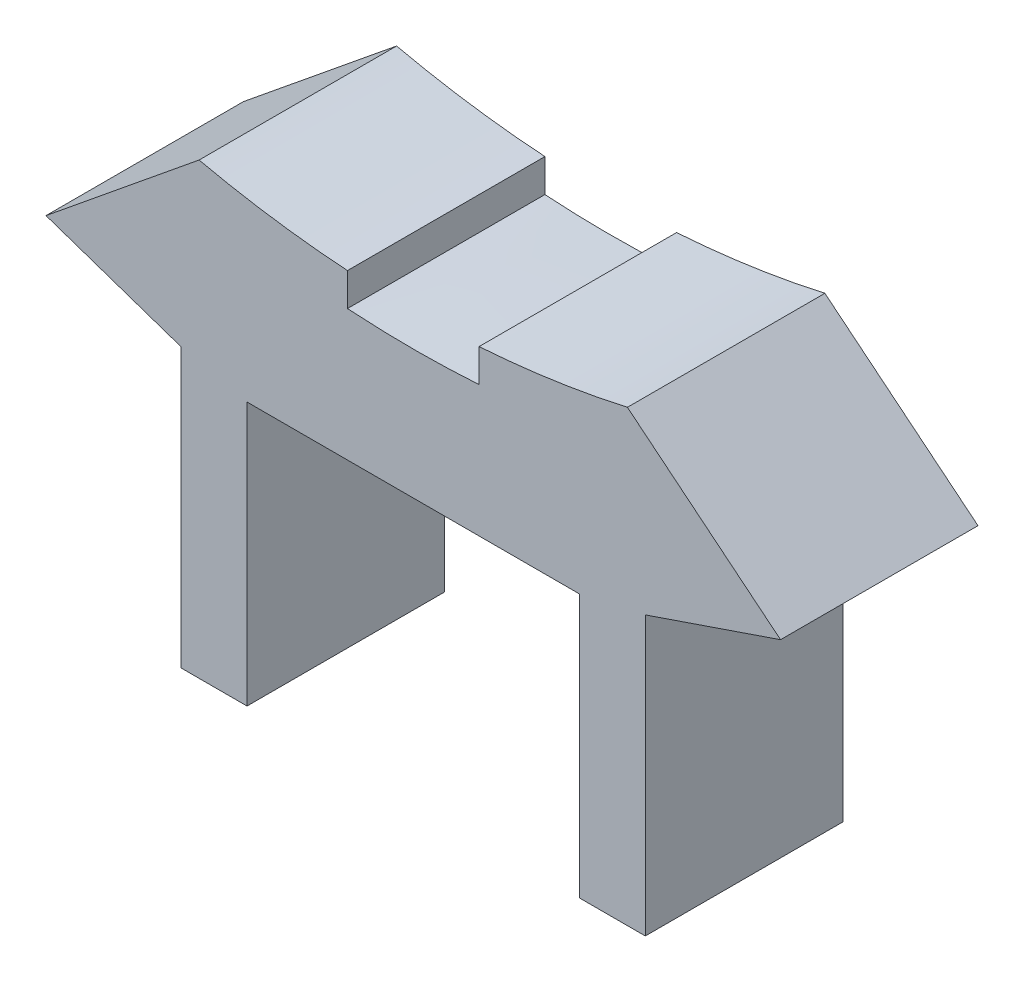
ISO-10303-21;
HEADER;
FILE_DESCRIPTION(('STEP AP214'),'2;1');
FILE_NAME('part.step','',(''),(''),'','','');
FILE_SCHEMA(('AUTOMOTIVE_DESIGN { 1 0 10303 214 1 1 1 1 }'));
ENDSEC;
DATA;
#1=APPLICATION_CONTEXT('core data for automotive mechanical design processes');
#2=APPLICATION_PROTOCOL_DEFINITION('international standard','automotive_design',2000,#1);
#3=PRODUCT_CONTEXT('',#1,'mechanical');
#4=PRODUCT('Part','Part','',(#3));
#5=PRODUCT_RELATED_PRODUCT_CATEGORY('part','',(#4));
#6=PRODUCT_DEFINITION_FORMATION('','',#4);
#7=PRODUCT_DEFINITION_CONTEXT('part definition',#1,'design');
#8=PRODUCT_DEFINITION('design','',#6,#7);
#9=PRODUCT_DEFINITION_SHAPE('','',#8);
#10=(LENGTH_UNIT() NAMED_UNIT(*) SI_UNIT(.MILLI.,.METRE.));
#11=(NAMED_UNIT(*) PLANE_ANGLE_UNIT() SI_UNIT($,.RADIAN.));
#12=(NAMED_UNIT(*) SI_UNIT($,.STERADIAN.) SOLID_ANGLE_UNIT());
#13=UNCERTAINTY_MEASURE_WITH_UNIT(LENGTH_MEASURE(1.E-05),#10,'distance_accuracy_value','');
#14=(GEOMETRIC_REPRESENTATION_CONTEXT(3) GLOBAL_UNCERTAINTY_ASSIGNED_CONTEXT((#13)) GLOBAL_UNIT_ASSIGNED_CONTEXT((#10,
#11,#12)) REPRESENTATION_CONTEXT('',''));
#15=CARTESIAN_POINT('',(0.,0.,0.));
#16=DIRECTION('',(0.,0.,1.));
#17=DIRECTION('',(1.,0.,0.));
#18=AXIS2_PLACEMENT_3D('',#15,#16,#17);
#19=CARTESIAN_POINT('',(0.,2.46330733588707E-13,6.));
#20=DIRECTION('',(0.,0.,-1.));
#21=DIRECTION('',(-1.,0.,0.));
#22=AXIS2_PLACEMENT_3D('',#19,#20,#21);
#23=CYLINDRICAL_SURFACE('',#22,29.6427241251883);
#24=CARTESIAN_POINT('',(2.,-29.5751769827673,0.794104965163162));
#25=DIRECTION('',(0.,0.,-1.));
#26=VECTOR('',#25,1.);
#27=LINE('',#24,#26);
#28=CARTESIAN_POINT('',(2.,-29.5751753634774,0.794104965163163));
#29=VERTEX_POINT('',#28);
#30=CARTESIAN_POINT('',(1.99998290484577,-29.5753999279057,5.82734234378056E-11));
#31=VERTEX_POINT('',#30);
#32=EDGE_CURVE('E252',#29,#31,#27,.T.);
#33=ORIENTED_EDGE('',*,*,#32,.F.);
#34=CARTESIAN_POINT('',(2.,-29.5751769827673,1.46425258115946));
#35=DIRECTION('',(0.,0.,-1.));
#36=VECTOR('',#35,1.);
#37=LINE('',#34,#36);
#38=CARTESIAN_POINT('',(2.,-29.5751769827673,1.46425258115946));
#39=VERTEX_POINT('',#38);
#40=EDGE_CURVE('E247',#39,#29,#37,.T.);
#41=ORIENTED_EDGE('',*,*,#40,.F.);
#42=DIRECTION('',(0.,0.,1.));
#43=VECTOR('',#42,1.);
#44=CARTESIAN_POINT('',(2.,-29.5751769827673,6.));
#45=LINE('',#44,#43);
#46=CARTESIAN_POINT('',(2.,-29.5751769827673,4.53627099661344));
#47=VERTEX_POINT('',#46);
#48=EDGE_CURVE('E236',#47,#39,#45,.F.);
#49=ORIENTED_EDGE('',*,*,#48,.F.);
#50=CARTESIAN_POINT('',(2.,-29.5751769827673,5.20603168382745));
#51=DIRECTION('',(0.,0.,-1.));
#52=VECTOR('',#51,1.);
#53=LINE('',#50,#52);
#54=CARTESIAN_POINT('',(2.,-29.5751754602162,5.20603168382745));
#55=VERTEX_POINT('',#54);
#56=EDGE_CURVE('E231',#55,#47,#53,.T.);
#57=ORIENTED_EDGE('',*,*,#56,.F.);
#58=DIRECTION('',(0.,0.,1.));
#59=VECTOR('',#58,1.);
#60=CARTESIAN_POINT('',(2.,-29.5751769827673,6.));
#61=LINE('',#60,#59);
#62=CARTESIAN_POINT('',(2.,-29.5751769827673,6.));
#63=VERTEX_POINT('',#62);
#64=EDGE_CURVE('E239',#63,#55,#61,.F.);
#65=ORIENTED_EDGE('',*,*,#64,.F.);
#66=CARTESIAN_POINT('',(0.,2.46330733588707E-13,6.));
#67=DIRECTION('',(0.,0.,-1.));
#68=DIRECTION('',(1.,0.,0.));
#69=AXIS2_PLACEMENT_3D('',#66,#67,#68);
#70=CIRCLE('',#69,29.6427241251883);
#71=CARTESIAN_POINT('',(6.50697593404914,-28.9197226431325,6.));
#72=VERTEX_POINT('',#71);
#73=EDGE_CURVE('E345',#72,#63,#70,.T.);
#74=ORIENTED_EDGE('',*,*,#73,.F.);
#75=DIRECTION('',(0.,0.,-1.));
#76=VECTOR('',#75,1.);
#77=CARTESIAN_POINT('',(6.50697593404914,-28.9197226431325,6.));
#78=LINE('',#77,#76);
#79=CARTESIAN_POINT('',(6.50697593404914,-28.9197226431325,0.));
#80=VERTEX_POINT('',#79);
#81=EDGE_CURVE('E302',#72,#80,#78,.T.);
#82=ORIENTED_EDGE('',*,*,#81,.T.);
#83=CARTESIAN_POINT('',(0.,2.46330733588707E-13,0.));
#84=DIRECTION('',(0.,0.,-1.));
#85=DIRECTION('',(1.,0.,0.));
#86=AXIS2_PLACEMENT_3D('',#83,#84,#85);
#87=CIRCLE('',#86,29.6427241251883);
#88=EDGE_CURVE('E306',#80,#31,#87,.T.);
#89=ORIENTED_EDGE('',*,*,#88,.T.);
#90=EDGE_LOOP('',(#33,#41,#49,#57,#65,#74,#82,#89));
#91=FACE_BOUND('',#90,.T.);
#92=ADVANCED_FACE('F89',(#91),#23,.F.);
#93=CARTESIAN_POINT('',(0.,2.46330733588707E-13,6.));
#94=DIRECTION('',(0.,0.,1.));
#95=DIRECTION('',(1.,0.,0.));
#96=AXIS2_PLACEMENT_3D('',#93,#94,#95);
#97=PLANE('',#96);
#98=ORIENTED_EDGE('',*,*,#73,.T.);
#99=DIRECTION('',(0.,-1.,0.));
#100=VECTOR('',#99,1.);
#101=CARTESIAN_POINT('',(2.,-29.5751769827673,6.));
#102=LINE('',#101,#100);
#103=CARTESIAN_POINT('',(1.99999999993751,-30.5758905770925,6.));
#104=VERTEX_POINT('',#103);
#105=EDGE_CURVE('E403',#63,#104,#102,.T.);
#106=ORIENTED_EDGE('',*,*,#105,.T.);
#107=CARTESIAN_POINT('',(-2.,-30.5761285399981,6.));
#108=CARTESIAN_POINT('',(-1.91668888544796,-30.5813932001455,6.));
#109=CARTESIAN_POINT('',(-1.83336000291558,-30.5863808461374,6.));
#110=CARTESIAN_POINT('',(-1.66670065223996,-30.595766432718,6.));
#111=CARTESIAN_POINT('',(-1.58337019658692,-30.6001645953618,6.));
#112=CARTESIAN_POINT('',(-1.41670746324046,-30.6083381563696,6.));
#113=CARTESIAN_POINT('',(-1.33337519609819,-30.6121137691073,6.));
#114=CARTESIAN_POINT('',(-1.16670900211733,-30.6190153944898,6.));
#115=CARTESIAN_POINT('',(-1.08337508343158,-30.6221416036082,6.));
#116=CARTESIAN_POINT('',(-0.916705780400924,-30.6277221687569,6.));
#117=CARTESIAN_POINT('',(-0.833370401748876,-30.6301766943803,6.));
#118=CARTESIAN_POINT('',(-0.666698475997224,-30.6343966682864,6.));
#119=CARTESIAN_POINT('',(-0.583361932317296,-30.6361622513151,6.));
#120=CARTESIAN_POINT('',(-0.41668803091709,-30.6389920299726,6.));
#121=CARTESIAN_POINT('',(-0.333350674788869,-30.6400563191487,6.));
#122=CARTESIAN_POINT('',(-0.166675545586474,-30.6414761478316,6.));
#123=CARTESIAN_POINT('',(-0.0833377729214095,-30.6418317352508,6.));
#124=CARTESIAN_POINT('',(0.0833377724103954,-30.6418317375408,6.));
#125=CARTESIAN_POINT('',(0.166675545077136,-30.6414761524118,6.));
#126=CARTESIAN_POINT('',(0.333350674286005,-30.6400563275434,6.));
#127=CARTESIAN_POINT('',(0.416688030419025,-30.6389920398918,6.));
#128=CARTESIAN_POINT('',(0.583361931831253,-30.636162262806,6.));
#129=CARTESIAN_POINT('',(0.6666984755184,-30.6343966798242,6.));
#130=CARTESIAN_POINT('',(0.833370401285858,-30.6301767039316,6.));
#131=CARTESIAN_POINT('',(0.916705779946469,-30.6277221762737,6.));
#132=CARTESIAN_POINT('',(1.08337508299401,-30.6221416045318,6.));
#133=CARTESIAN_POINT('',(1.16670900168803,-30.6190153908531,6.));
#134=CARTESIAN_POINT('',(1.33337519568399,-30.6121137536041,6.));
#135=CARTESIAN_POINT('',(1.416707462833,-30.6083381335582,6.));
#136=CARTESIAN_POINT('',(1.58337019618748,-30.6001645552079,6.));
#137=CARTESIAN_POINT('',(1.66670065184165,-30.5957663825276,6.));
#138=CARTESIAN_POINT('',(1.83336000251967,-30.58638077359,6.));
#139=CARTESIAN_POINT('',(1.91668888505314,-30.5813931152753,6.));
#140=CARTESIAN_POINT('',(1.99999999950001,-30.576128441894,6.));
#141=B_SPLINE_CURVE_WITH_KNOTS('',3,(#107,#108,#109,#110,#111,#112,#113,#114,#115,#116,#117,
#118,#119,#120,#121,#122,#123,#124,#125,#126,#127,#128,#129,#130,#131,#132,#133,#134,#135,#136,
#137,#138,#139,#140),.UNSPECIFIED.,.F.,.F.,(4,2,2,2,2,2,2,2,2,2,2,2,2,2,2,2,4),(0.,
0.250431807196232,0.500769011347074,0.751019831646624,1.00119482930428,1.25130660195479,
1.50136943223462,1.75139889931203,2.00141146239737,2.25142402545511,2.50145349247889,
2.75151632276235,3.00162809559912,3.25180309377338,3.50205391506377,3.75239112078796,
4.00282293017717),.UNSPECIFIED.);
#142=CARTESIAN_POINT('',(-2.,-30.575414872075,6.));
#143=VERTEX_POINT('',#142);
#144=EDGE_CURVE('E462',#143,#104,#141,.T.);
#145=ORIENTED_EDGE('',*,*,#144,.F.);
#146=DIRECTION('',(0.,-1.,0.));
#147=VECTOR('',#146,1.);
#148=CARTESIAN_POINT('',(-2.,-29.5751769827673,6.));
#149=LINE('',#148,#147);
#150=CARTESIAN_POINT('',(-1.99999999999999,-29.5751769827673,6.));
#151=VERTEX_POINT('',#150);
#152=EDGE_CURVE('E474',#151,#143,#149,.T.);
#153=ORIENTED_EDGE('',*,*,#152,.F.);
#154=CARTESIAN_POINT('',(-6.50697593404914,-28.9197226431325,6.));
#155=VERTEX_POINT('',#154);
#156=EDGE_CURVE('E399',#151,#155,#70,.T.);
#157=ORIENTED_EDGE('',*,*,#156,.T.);
#158=DIRECTION('',(-0.775362594719005,-0.631516307557146,0.));
#159=VECTOR('',#158,1.);
#160=CARTESIAN_POINT('',(-6.50697593404913,-28.9197226431325,6.));
#161=LINE('',#160,#159);
#162=CARTESIAN_POINT('',(-11.1591515023631,-32.7088204884754,6.));
#163=VERTEX_POINT('',#162);
#164=EDGE_CURVE('E396',#155,#163,#161,.T.);
#165=ORIENTED_EDGE('',*,*,#164,.T.);
#166=DIRECTION('',(0.946435778023014,-0.322892115230417,0.));
#167=VECTOR('',#166,1.);
#168=CARTESIAN_POINT('',(-7.05077241239505,-34.1104615140284,6.));
#169=LINE('',#168,#167);
#170=CARTESIAN_POINT('',(-7.05077241239505,-34.1104615140284,6.));
#171=VERTEX_POINT('',#170);
#172=EDGE_CURVE('E393',#163,#171,#169,.T.);
#173=ORIENTED_EDGE('',*,*,#172,.T.);
#174=DIRECTION('',(0.,-1.,0.));
#175=VECTOR('',#174,1.);
#176=CARTESIAN_POINT('',(-7.05077241239505,-42.56,6.));
#177=LINE('',#176,#175);
#178=CARTESIAN_POINT('',(-7.05077241239505,-42.56,6.));
#179=VERTEX_POINT('',#178);
#180=EDGE_CURVE('E390',#171,#179,#177,.T.);
#181=ORIENTED_EDGE('',*,*,#180,.T.);
#182=DIRECTION('',(1.,0.,0.));
#183=VECTOR('',#182,1.);
#184=CARTESIAN_POINT('',(-5.05077241239505,-42.56,6.));
#185=LINE('',#184,#183);
#186=CARTESIAN_POINT('',(-5.05077241239505,-42.56,6.));
#187=VERTEX_POINT('',#186);
#188=EDGE_CURVE('E386',#179,#187,#185,.T.);
#189=ORIENTED_EDGE('',*,*,#188,.T.);
#190=DIRECTION('',(0.,1.,0.));
#191=VECTOR('',#190,1.);
#192=CARTESIAN_POINT('',(-5.05077241239505,-34.56,6.));
#193=LINE('',#192,#191);
#194=CARTESIAN_POINT('',(-5.05077241239505,-34.56,6.));
#195=VERTEX_POINT('',#194);
#196=EDGE_CURVE('E389',#187,#195,#193,.T.);
#197=ORIENTED_EDGE('',*,*,#196,.T.);
#198=DIRECTION('',(1.,0.,0.));
#199=VECTOR('',#198,1.);
#200=CARTESIAN_POINT('',(5.05077241239505,-34.56,6.));
#201=LINE('',#200,#199);
#202=CARTESIAN_POINT('',(5.05077241239505,-34.56,6.));
#203=VERTEX_POINT('',#202);
#204=EDGE_CURVE('E419',#195,#203,#201,.T.);
#205=ORIENTED_EDGE('',*,*,#204,.T.);
#206=DIRECTION('',(0.,-1.,0.));
#207=VECTOR('',#206,1.);
#208=CARTESIAN_POINT('',(5.05077241239505,-34.56,6.));
#209=LINE('',#208,#207);
#210=CARTESIAN_POINT('',(5.05077241239505,-42.56,6.));
#211=VERTEX_POINT('',#210);
#212=EDGE_CURVE('E416',#203,#211,#209,.T.);
#213=ORIENTED_EDGE('',*,*,#212,.T.);
#214=DIRECTION('',(1.,0.,0.));
#215=VECTOR('',#214,1.);
#216=CARTESIAN_POINT('',(5.05077241239505,-42.56,6.));
#217=LINE('',#216,#215);
#218=CARTESIAN_POINT('',(7.05077241239505,-42.56,6.));
#219=VERTEX_POINT('',#218);
#220=EDGE_CURVE('E413',#211,#219,#217,.T.);
#221=ORIENTED_EDGE('',*,*,#220,.T.);
#222=DIRECTION('',(0.,1.,0.));
#223=VECTOR('',#222,1.);
#224=CARTESIAN_POINT('',(7.05077241239505,-42.56,6.));
#225=LINE('',#224,#223);
#226=CARTESIAN_POINT('',(7.05077241239505,-34.1104615140284,6.));
#227=VERTEX_POINT('',#226);
#228=EDGE_CURVE('E410',#219,#227,#225,.T.);
#229=ORIENTED_EDGE('',*,*,#228,.T.);
#230=DIRECTION('',(0.946435778023014,0.322892115230417,0.));
#231=VECTOR('',#230,1.);
#232=CARTESIAN_POINT('',(7.05077241239505,-34.1104615140284,6.));
#233=LINE('',#232,#231);
#234=CARTESIAN_POINT('',(11.1591515023631,-32.7088204884754,6.));
#235=VERTEX_POINT('',#234);
#236=EDGE_CURVE('E407',#227,#235,#233,.T.);
#237=ORIENTED_EDGE('',*,*,#236,.T.);
#238=DIRECTION('',(-0.775362594719005,0.631516307557146,0.));
#239=VECTOR('',#238,1.);
#240=CARTESIAN_POINT('',(6.50697593404914,-28.9197226431325,6.));
#241=LINE('',#240,#239);
#242=EDGE_CURVE('E404',#235,#72,#241,.T.);
#243=ORIENTED_EDGE('',*,*,#242,.T.);
#244=EDGE_LOOP('',(#98,#106,#145,#153,#157,#165,#173,#181,#189,#197,#205,#213,#221,#229,#237,#243));
#245=FACE_BOUND('',#244,.T.);
#246=ADVANCED_FACE('F465',(#245),#97,.T.);
#247=CARTESIAN_POINT('',(0.,2.46330733588707E-13,0.));
#248=DIRECTION('',(0.,0.,1.));
#249=DIRECTION('',(1.,0.,0.));
#250=AXIS2_PLACEMENT_3D('',#247,#248,#249);
#251=PLANE('',#250);
#252=DIRECTION('',(0.,-1.,0.));
#253=VECTOR('',#252,1.);
#254=CARTESIAN_POINT('',(2.,-29.5751769827673,0.));
#255=LINE('',#254,#253);
#256=CARTESIAN_POINT('',(2.00000000000001,-30.5758906068335,6.24993796648095E-11));
#257=VERTEX_POINT('',#256);
#258=EDGE_CURVE('E459',#31,#257,#255,.T.);
#259=ORIENTED_EDGE('',*,*,#258,.F.);
#260=ORIENTED_EDGE('',*,*,#88,.F.);
#261=DIRECTION('',(-0.775362594719005,0.631516307557146,0.));
#262=VECTOR('',#261,1.);
#263=CARTESIAN_POINT('',(6.50697593404914,-28.9197226431325,0.));
#264=LINE('',#263,#262);
#265=CARTESIAN_POINT('',(11.1591515023631,-32.7088204884754,0.));
#266=VERTEX_POINT('',#265);
#267=EDGE_CURVE('E290',#266,#80,#264,.T.);
#268=ORIENTED_EDGE('',*,*,#267,.F.);
#269=DIRECTION('',(0.946435778023014,0.322892115230417,0.));
#270=VECTOR('',#269,1.);
#271=CARTESIAN_POINT('',(7.05077241239505,-34.1104615140284,0.));
#272=LINE('',#271,#270);
#273=CARTESIAN_POINT('',(7.05077241239505,-34.1104615140284,0.));
#274=VERTEX_POINT('',#273);
#275=EDGE_CURVE('E365',#274,#266,#272,.T.);
#276=ORIENTED_EDGE('',*,*,#275,.F.);
#277=DIRECTION('',(0.,1.,0.));
#278=VECTOR('',#277,1.);
#279=CARTESIAN_POINT('',(7.05077241239505,-42.56,0.));
#280=LINE('',#279,#278);
#281=CARTESIAN_POINT('',(7.05077241239505,-42.56,0.));
#282=VERTEX_POINT('',#281);
#283=EDGE_CURVE('E361',#282,#274,#280,.T.);
#284=ORIENTED_EDGE('',*,*,#283,.F.);
#285=DIRECTION('',(1.,0.,0.));
#286=VECTOR('',#285,1.);
#287=CARTESIAN_POINT('',(5.05077241239505,-42.56,0.));
#288=LINE('',#287,#286);
#289=CARTESIAN_POINT('',(5.05077241239505,-42.56,0.));
#290=VERTEX_POINT('',#289);
#291=EDGE_CURVE('E357',#290,#282,#288,.T.);
#292=ORIENTED_EDGE('',*,*,#291,.F.);
#293=DIRECTION('',(0.,-1.,0.));
#294=VECTOR('',#293,1.);
#295=CARTESIAN_POINT('',(5.05077241239505,-34.56,0.));
#296=LINE('',#295,#294);
#297=CARTESIAN_POINT('',(5.05077241239505,-34.56,0.));
#298=VERTEX_POINT('',#297);
#299=EDGE_CURVE('E352',#298,#290,#296,.T.);
#300=ORIENTED_EDGE('',*,*,#299,.F.);
#301=DIRECTION('',(1.,0.,0.));
#302=VECTOR('',#301,1.);
#303=CARTESIAN_POINT('',(5.05077241239505,-34.56,0.));
#304=LINE('',#303,#302);
#305=CARTESIAN_POINT('',(-5.05077241239505,-34.56,0.));
#306=VERTEX_POINT('',#305);
#307=EDGE_CURVE('E329',#306,#298,#304,.T.);
#308=ORIENTED_EDGE('',*,*,#307,.F.);
#309=DIRECTION('',(0.,1.,0.));
#310=VECTOR('',#309,1.);
#311=CARTESIAN_POINT('',(-5.05077241239505,-34.56,0.));
#312=LINE('',#311,#310);
#313=CARTESIAN_POINT('',(-5.05077241239505,-42.56,0.));
#314=VERTEX_POINT('',#313);
#315=EDGE_CURVE('E330',#314,#306,#312,.T.);
#316=ORIENTED_EDGE('',*,*,#315,.F.);
#317=DIRECTION('',(1.,0.,0.));
#318=VECTOR('',#317,1.);
#319=CARTESIAN_POINT('',(-5.05077241239505,-42.56,0.));
#320=LINE('',#319,#318);
#321=CARTESIAN_POINT('',(-7.05077241239505,-42.56,0.));
#322=VERTEX_POINT('',#321);
#323=EDGE_CURVE('E321',#322,#314,#320,.T.);
#324=ORIENTED_EDGE('',*,*,#323,.F.);
#325=DIRECTION('',(0.,-1.,0.));
#326=VECTOR('',#325,1.);
#327=CARTESIAN_POINT('',(-7.05077241239505,-42.56,0.));
#328=LINE('',#327,#326);
#329=CARTESIAN_POINT('',(-7.05077241239505,-34.1104615140284,0.));
#330=VERTEX_POINT('',#329);
#331=EDGE_CURVE('E316',#330,#322,#328,.T.);
#332=ORIENTED_EDGE('',*,*,#331,.F.);
#333=DIRECTION('',(0.946435778023014,-0.322892115230417,0.));
#334=VECTOR('',#333,1.);
#335=CARTESIAN_POINT('',(-7.05077241239505,-34.1104615140284,0.));
#336=LINE('',#335,#334);
#337=CARTESIAN_POINT('',(-11.1591515023631,-32.7088204884754,0.));
#338=VERTEX_POINT('',#337);
#339=EDGE_CURVE('E311',#338,#330,#336,.T.);
#340=ORIENTED_EDGE('',*,*,#339,.F.);
#341=DIRECTION('',(-0.775362594719005,-0.631516307557146,0.));
#342=VECTOR('',#341,1.);
#343=CARTESIAN_POINT('',(-6.50697593404913,-28.9197226431325,0.));
#344=LINE('',#343,#342);
#345=CARTESIAN_POINT('',(-6.50697593404914,-28.9197226431325,0.));
#346=VERTEX_POINT('',#345);
#347=EDGE_CURVE('E268',#346,#338,#344,.T.);
#348=ORIENTED_EDGE('',*,*,#347,.F.);
#349=CARTESIAN_POINT('',(-1.99999999999999,-29.5751769827673,0.));
#350=VERTEX_POINT('',#349);
#351=EDGE_CURVE('E273',#350,#346,#87,.T.);
#352=ORIENTED_EDGE('',*,*,#351,.F.);
#353=DIRECTION('',(0.,-1.,0.));
#354=VECTOR('',#353,1.);
#355=CARTESIAN_POINT('',(-2.,-29.5751769827673,0.));
#356=LINE('',#355,#354);
#357=CARTESIAN_POINT('',(-1.9999999999375,-30.5754148487883,0.));
#358=VERTEX_POINT('',#357);
#359=EDGE_CURVE('E385',#350,#358,#356,.T.);
#360=ORIENTED_EDGE('',*,*,#359,.T.);
#361=CARTESIAN_POINT('',(2.00000000000001,-30.5761284815225,0.));
#362=CARTESIAN_POINT('',(1.91668888581509,-30.5813931609594,0.));
#363=CARTESIAN_POINT('',(1.83336000323441,-30.5863808203168,0.));
#364=CARTESIAN_POINT('',(1.66670065246178,-30.5957664251919,0.));
#365=CARTESIAN_POINT('',(1.58337019676046,-30.6001645927719,0.));
#366=CARTESIAN_POINT('',(1.41670746333853,-30.6083381586923,0.));
#367=CARTESIAN_POINT('',(1.33337519616926,-30.61211377141,0.));
#368=CARTESIAN_POINT('',(1.1667090021457,-30.6190153942503,0.));
#369=CARTESIAN_POINT('',(1.0833750834443,-30.622141600848,0.));
#370=CARTESIAN_POINT('',(0.916705780392056,-30.6277221602718,0.));
#371=CARTESIAN_POINT('',(0.833370401734061,-30.6301766826914,0.));
#372=CARTESIAN_POINT('',(0.666698475976545,-30.6343966506995,0.));
#373=CARTESIAN_POINT('',(0.583361932296684,-30.6361622310338,0.));
#374=CARTESIAN_POINT('',(0.41668803089989,-30.6389920054907,0.));
#375=CARTESIAN_POINT('',(0.333350674775004,-30.64005629316,0.));
#376=CARTESIAN_POINT('',(0.166675545580127,-30.6414761202658,0.));
#377=CARTESIAN_POINT('',(0.0833377729192452,-30.6418317076142,0.));
#378=CARTESIAN_POINT('',(-0.0833377724051366,-30.6418317111093,0.));
#379=CARTESIAN_POINT('',(-0.166675545068636,-30.641476127256,0.));
#380=CARTESIAN_POINT('',(-0.333350674273101,-30.6400563059473,0.));
#381=CARTESIAN_POINT('',(-0.416688030404961,-30.63899202058,0.));
#382=CARTESIAN_POINT('',(-0.583361931817371,-30.6361622485751,0.));
#383=CARTESIAN_POINT('',(-0.666698475505866,-30.6343966683903,0.));
#384=CARTESIAN_POINT('',(-0.833370401278289,-30.6301766980413,0.));
#385=CARTESIAN_POINT('',(-0.916705779942524,-30.6277221731304,0.));
#386=CARTESIAN_POINT('',(-1.08337508299854,-30.6221416062902,0.));
#387=CARTESIAN_POINT('',(-1.1667090016974,-30.6190153947662,0.));
#388=CARTESIAN_POINT('',(-1.33337519570318,-30.6121137608133,0.));
#389=CARTESIAN_POINT('',(-1.41670746285714,-30.6083381419083,0.));
#390=CARTESIAN_POINT('',(-1.58337019621802,-30.600164564581,0.));
#391=CARTESIAN_POINT('',(-1.66670065187361,-30.5957663917819,0.));
#392=CARTESIAN_POINT('',(-1.8333600025545,-30.5863807814976,0.));
#393=CARTESIAN_POINT('',(-1.91668888508939,-30.581393121954,0.));
#394=CARTESIAN_POINT('',(-1.9999999995,-30.576128446867,0.));
#395=B_SPLINE_CURVE_WITH_KNOTS('',3,(#361,#362,#363,#364,#365,#366,#367,#368,#369,#370,#371,
#372,#373,#374,#375,#376,#377,#378,#379,#380,#381,#382,#383,#384,#385,#386,#387,#388,#389,#390,
#391,#392,#393,#394),.UNSPECIFIED.,.F.,.F.,(4,2,2,2,2,2,2,2,2,2,2,2,2,2,2,2,4),(0.,
0.250431809692134,0.500769014713299,0.751019835065529,1.00119483247416,1.25130660485972,
1.5013694349758,1.75139890199715,2.00141146508131,2.25142402812333,2.50145349506271,
2.75151632517443,3.00162809777669,3.25180309571665,3.50205391685771,3.7523911225966,
4.00282293220124),.UNSPECIFIED.);
#396=EDGE_CURVE('E13',#257,#358,#395,.T.);
#397=ORIENTED_EDGE('',*,*,#396,.F.);
#398=EDGE_LOOP('',(#259,#260,#268,#276,#284,#292,#300,#308,#316,#324,#332,#340,#348,#352,#360,#397));
#399=FACE_BOUND('',#398,.T.);
#400=ADVANCED_FACE('F519',(#399),#251,.F.);
#401=CARTESIAN_POINT('',(-5.05077241239505,-34.56,6.));
#402=DIRECTION('',(-1.,0.,0.));
#403=DIRECTION('',(0.,-1.,0.));
#404=AXIS2_PLACEMENT_3D('',#401,#402,#403);
#405=PLANE('',#404);
#406=ORIENTED_EDGE('',*,*,#315,.T.);
#407=DIRECTION('',(0.,0.,-1.));
#408=VECTOR('',#407,1.);
#409=CARTESIAN_POINT('',(-5.05077241239505,-34.56,6.));
#410=LINE('',#409,#408);
#411=EDGE_CURVE('E348',#195,#306,#410,.T.);
#412=ORIENTED_EDGE('',*,*,#411,.F.);
#413=ORIENTED_EDGE('',*,*,#196,.F.);
#414=DIRECTION('',(0.,0.,-1.));
#415=VECTOR('',#414,1.);
#416=CARTESIAN_POINT('',(-5.05077241239505,-42.56,6.));
#417=LINE('',#416,#415);
#418=EDGE_CURVE('E325',#187,#314,#417,.T.);
#419=ORIENTED_EDGE('',*,*,#418,.T.);
#420=EDGE_LOOP('',(#406,#412,#413,#419));
#421=FACE_BOUND('',#420,.T.);
#422=ADVANCED_FACE('F496',(#421),#405,.F.);
#423=CARTESIAN_POINT('',(5.05077241239505,-34.56,6.));
#424=DIRECTION('',(0.,1.,0.));
#425=DIRECTION('',(0.,0.,1.));
#426=AXIS2_PLACEMENT_3D('',#423,#424,#425);
#427=PLANE('',#426);
#428=ORIENTED_EDGE('',*,*,#307,.T.);
#429=DIRECTION('',(0.,0.,-1.));
#430=VECTOR('',#429,1.);
#431=CARTESIAN_POINT('',(5.05077241239505,-34.56,6.));
#432=LINE('',#431,#430);
#433=EDGE_CURVE('E353',#203,#298,#432,.T.);
#434=ORIENTED_EDGE('',*,*,#433,.F.);
#435=ORIENTED_EDGE('',*,*,#204,.F.);
#436=ORIENTED_EDGE('',*,*,#411,.T.);
#437=EDGE_LOOP('',(#428,#434,#435,#436));
#438=FACE_BOUND('',#437,.T.);
#439=ADVANCED_FACE('F501',(#438),#427,.F.);
#440=CARTESIAN_POINT('',(5.05077241239505,-34.56,6.));
#441=DIRECTION('',(1.,0.,0.));
#442=DIRECTION('',(0.,1.,0.));
#443=AXIS2_PLACEMENT_3D('',#440,#441,#442);
#444=PLANE('',#443);
#445=ORIENTED_EDGE('',*,*,#299,.T.);
#446=DIRECTION('',(0.,0.,-1.));
#447=VECTOR('',#446,1.);
#448=CARTESIAN_POINT('',(5.05077241239505,-42.56,6.));
#449=LINE('',#448,#447);
#450=EDGE_CURVE('E358',#211,#290,#449,.T.);
#451=ORIENTED_EDGE('',*,*,#450,.F.);
#452=ORIENTED_EDGE('',*,*,#212,.F.);
#453=ORIENTED_EDGE('',*,*,#433,.T.);
#454=EDGE_LOOP('',(#445,#451,#452,#453));
#455=FACE_BOUND('',#454,.T.);
#456=ADVANCED_FACE('F504',(#455),#444,.F.);
#457=CARTESIAN_POINT('',(5.05077241239505,-42.56,6.));
#458=DIRECTION('',(0.,1.,0.));
#459=DIRECTION('',(0.,0.,1.));
#460=AXIS2_PLACEMENT_3D('',#457,#458,#459);
#461=PLANE('',#460);
#462=ORIENTED_EDGE('',*,*,#291,.T.);
#463=DIRECTION('',(0.,0.,-1.));
#464=VECTOR('',#463,1.);
#465=CARTESIAN_POINT('',(7.05077241239505,-42.56,6.));
#466=LINE('',#465,#464);
#467=EDGE_CURVE('E362',#219,#282,#466,.T.);
#468=ORIENTED_EDGE('',*,*,#467,.F.);
#469=ORIENTED_EDGE('',*,*,#220,.F.);
#470=ORIENTED_EDGE('',*,*,#450,.T.);
#471=EDGE_LOOP('',(#462,#468,#469,#470));
#472=FACE_BOUND('',#471,.T.);
#473=ADVANCED_FACE('F508',(#472),#461,.F.);
#474=CARTESIAN_POINT('',(7.05077241239505,-42.56,6.));
#475=DIRECTION('',(-1.,0.,0.));
#476=DIRECTION('',(0.,0.,1.));
#477=AXIS2_PLACEMENT_3D('',#474,#475,#476);
#478=PLANE('',#477);
#479=ORIENTED_EDGE('',*,*,#283,.T.);
#480=DIRECTION('',(0.,0.,-1.));
#481=VECTOR('',#480,1.);
#482=CARTESIAN_POINT('',(7.05077241239505,-34.1104615140284,6.));
#483=LINE('',#482,#481);
#484=EDGE_CURVE('E297',#227,#274,#483,.T.);
#485=ORIENTED_EDGE('',*,*,#484,.F.);
#486=ORIENTED_EDGE('',*,*,#228,.F.);
#487=ORIENTED_EDGE('',*,*,#467,.T.);
#488=EDGE_LOOP('',(#479,#485,#486,#487));
#489=FACE_BOUND('',#488,.T.);
#490=ADVANCED_FACE('F510',(#489),#478,.F.);
#491=CARTESIAN_POINT('',(7.05077241239505,-34.1104615140284,6.));
#492=DIRECTION('',(-0.322892115230416,0.946435778023014,0.));
#493=DIRECTION('',(-0.946435778023014,-0.322892115230417,0.));
#494=AXIS2_PLACEMENT_3D('',#491,#492,#493);
#495=PLANE('',#494);
#496=ORIENTED_EDGE('',*,*,#275,.T.);
#497=DIRECTION('',(0.,0.,-1.));
#498=VECTOR('',#497,1.);
#499=CARTESIAN_POINT('',(11.1591515023631,-32.7088204884754,6.));
#500=LINE('',#499,#498);
#501=EDGE_CURVE('E286',#235,#266,#500,.T.);
#502=ORIENTED_EDGE('',*,*,#501,.F.);
#503=ORIENTED_EDGE('',*,*,#236,.F.);
#504=ORIENTED_EDGE('',*,*,#484,.T.);
#505=EDGE_LOOP('',(#496,#502,#503,#504));
#506=FACE_BOUND('',#505,.T.);
#507=ADVANCED_FACE('F514',(#506),#495,.F.);
#508=CARTESIAN_POINT('',(6.50697593404914,-28.9197226431325,6.));
#509=DIRECTION('',(-0.631516307557146,-0.775362594719005,0.));
#510=DIRECTION('',(0.775362594719006,-0.631516307557146,0.));
#511=AXIS2_PLACEMENT_3D('',#508,#509,#510);
#512=PLANE('',#511);
#513=ORIENTED_EDGE('',*,*,#267,.T.);
#514=ORIENTED_EDGE('',*,*,#81,.F.);
#515=ORIENTED_EDGE('',*,*,#242,.F.);
#516=ORIENTED_EDGE('',*,*,#501,.T.);
#517=EDGE_LOOP('',(#513,#514,#515,#516));
#518=FACE_BOUND('',#517,.T.);
#519=ADVANCED_FACE('F516',(#518),#512,.F.);
#520=CARTESIAN_POINT('',(-1.99999999999998,-29.5751769827673,1.46377447182746));
#521=DIRECTION('',(0.,0.,-1.));
#522=VECTOR('',#521,1.);
#523=LINE('',#520,#522);
#524=CARTESIAN_POINT('',(-2.,-29.5751769827673,1.46377447181269));
#525=VERTEX_POINT('',#524);
#526=CARTESIAN_POINT('',(-2.,-29.5751754606374,0.793944031697488));
#527=VERTEX_POINT('',#526);
#528=EDGE_CURVE('E278',#525,#527,#523,.T.);
#529=ORIENTED_EDGE('',*,*,#528,.T.);
#530=DIRECTION('',(0.,0.,-1.));
#531=VECTOR('',#530,1.);
#532=CARTESIAN_POINT('',(-1.99999999999998,-29.5751769827673,6.));
#533=LINE('',#532,#531);
#534=EDGE_CURVE('E275',#527,#350,#533,.T.);
#535=ORIENTED_EDGE('',*,*,#534,.T.);
#536=ORIENTED_EDGE('',*,*,#351,.T.);
#537=DIRECTION('',(0.,0.,-1.));
#538=VECTOR('',#537,1.);
#539=CARTESIAN_POINT('',(-6.50697593404914,-28.9197226431325,6.));
#540=LINE('',#539,#538);
#541=EDGE_CURVE('E307',#155,#346,#540,.T.);
#542=ORIENTED_EDGE('',*,*,#541,.F.);
#543=ORIENTED_EDGE('',*,*,#156,.F.);
#544=DIRECTION('',(0.,0.,-1.));
#545=VECTOR('',#544,1.);
#546=CARTESIAN_POINT('',(-1.99999999999998,-29.5751769827673,6.));
#547=LINE('',#546,#545);
#548=CARTESIAN_POINT('',(-2.,-29.5751753555193,5.20547582106757));
#549=VERTEX_POINT('',#548);
#550=EDGE_CURVE('E128',#151,#549,#547,.T.);
#551=ORIENTED_EDGE('',*,*,#550,.T.);
#552=CARTESIAN_POINT('',(-1.99999999999998,-29.5751769827673,5.20547581982928));
#553=DIRECTION('',(0.,0.,-1.));
#554=VECTOR('',#553,1.);
#555=LINE('',#552,#554);
#556=CARTESIAN_POINT('',(-2.,-29.5751769827673,4.5361628415673));
#557=VERTEX_POINT('',#556);
#558=EDGE_CURVE('E133',#549,#557,#555,.T.);
#559=ORIENTED_EDGE('',*,*,#558,.T.);
#560=DIRECTION('',(0.,0.,-1.));
#561=VECTOR('',#560,1.);
#562=CARTESIAN_POINT('',(-1.99999999999998,-29.5751769827673,6.));
#563=LINE('',#562,#561);
#564=EDGE_CURVE('E139',#557,#525,#563,.T.);
#565=ORIENTED_EDGE('',*,*,#564,.T.);
#566=EDGE_LOOP('',(#529,#535,#536,#542,#543,#551,#559,#565));
#567=FACE_BOUND('',#566,.T.);
#568=ADVANCED_FACE('F91',(#567),#23,.F.);
#569=CARTESIAN_POINT('',(-6.50697593404913,-28.9197226431325,6.));
#570=DIRECTION('',(0.631516307557146,-0.775362594719005,0.));
#571=DIRECTION('',(0.775362594719005,0.631516307557146,0.));
#572=AXIS2_PLACEMENT_3D('',#569,#570,#571);
#573=PLANE('',#572);
#574=ORIENTED_EDGE('',*,*,#347,.T.);
#575=DIRECTION('',(0.,0.,-1.));
#576=VECTOR('',#575,1.);
#577=CARTESIAN_POINT('',(-11.1591515023631,-32.7088204884754,6.));
#578=LINE('',#577,#576);
#579=EDGE_CURVE('E312',#163,#338,#578,.T.);
#580=ORIENTED_EDGE('',*,*,#579,.F.);
#581=ORIENTED_EDGE('',*,*,#164,.F.);
#582=ORIENTED_EDGE('',*,*,#541,.T.);
#583=EDGE_LOOP('',(#574,#580,#581,#582));
#584=FACE_BOUND('',#583,.T.);
#585=ADVANCED_FACE('F477',(#584),#573,.F.);
#586=CARTESIAN_POINT('',(-7.05077241239505,-34.1104615140284,6.));
#587=DIRECTION('',(0.322892115230416,0.946435778023014,0.));
#588=DIRECTION('',(-0.946435778023014,0.322892115230417,0.));
#589=AXIS2_PLACEMENT_3D('',#586,#587,#588);
#590=PLANE('',#589);
#591=ORIENTED_EDGE('',*,*,#339,.T.);
#592=DIRECTION('',(0.,0.,-1.));
#593=VECTOR('',#592,1.);
#594=CARTESIAN_POINT('',(-7.05077241239505,-34.1104615140284,6.));
#595=LINE('',#594,#593);
#596=EDGE_CURVE('E317',#171,#330,#595,.T.);
#597=ORIENTED_EDGE('',*,*,#596,.F.);
#598=ORIENTED_EDGE('',*,*,#172,.F.);
#599=ORIENTED_EDGE('',*,*,#579,.T.);
#600=EDGE_LOOP('',(#591,#597,#598,#599));
#601=FACE_BOUND('',#600,.T.);
#602=ADVANCED_FACE('F482',(#601),#590,.F.);
#603=CARTESIAN_POINT('',(-7.05077241239505,-42.56,6.));
#604=DIRECTION('',(1.,0.,0.));
#605=DIRECTION('',(0.,0.,-1.));
#606=AXIS2_PLACEMENT_3D('',#603,#604,#605);
#607=PLANE('',#606);
#608=ORIENTED_EDGE('',*,*,#331,.T.);
#609=DIRECTION('',(0.,0.,-1.));
#610=VECTOR('',#609,1.);
#611=CARTESIAN_POINT('',(-7.05077241239505,-42.56,6.));
#612=LINE('',#611,#610);
#613=EDGE_CURVE('E263',#179,#322,#612,.T.);
#614=ORIENTED_EDGE('',*,*,#613,.F.);
#615=ORIENTED_EDGE('',*,*,#180,.F.);
#616=ORIENTED_EDGE('',*,*,#596,.T.);
#617=EDGE_LOOP('',(#608,#614,#615,#616));
#618=FACE_BOUND('',#617,.T.);
#619=ADVANCED_FACE('F488',(#618),#607,.F.);
#620=CARTESIAN_POINT('',(-5.05077241239505,-42.56,6.));
#621=DIRECTION('',(0.,1.,0.));
#622=DIRECTION('',(0.,0.,1.));
#623=AXIS2_PLACEMENT_3D('',#620,#621,#622);
#624=PLANE('',#623);
#625=ORIENTED_EDGE('',*,*,#323,.T.);
#626=ORIENTED_EDGE('',*,*,#418,.F.);
#627=ORIENTED_EDGE('',*,*,#188,.F.);
#628=ORIENTED_EDGE('',*,*,#613,.T.);
#629=EDGE_LOOP('',(#625,#626,#627,#628));
#630=FACE_BOUND('',#629,.T.);
#631=ADVANCED_FACE('F443',(#630),#624,.F.);
#632=CARTESIAN_POINT('',(2.,-29.5751769827673,6.));
#633=DIRECTION('',(-1.,0.,0.));
#634=DIRECTION('',(0.,0.,1.));
#635=AXIS2_PLACEMENT_3D('',#632,#633,#634);
#636=PLANE('',#635);
#637=CARTESIAN_POINT('',(2.,-30.5762695711664,6.06));
#638=CARTESIAN_POINT('',(2.,-30.5732668054005,4.83600000000001));
#639=CARTESIAN_POINT('',(2.,-30.5766698578393,3.61200000000001));
#640=CARTESIAN_POINT('',(2.,-30.5766700580369,2.388));
#641=CARTESIAN_POINT('',(2.,-30.5732662969925,1.164));
#642=CARTESIAN_POINT('',(2.,-30.5762696378036,-0.0600000000000014));
#643=B_SPLINE_CURVE_WITH_KNOTS('',5,(#637,#638,#639,#640,#641,#642),.UNSPECIFIED.,.F.,.F.,(6,6),
(-3.06,3.06),.UNSPECIFIED.);
#644=EDGE_CURVE('E101',#104,#257,#643,.T.);
#645=ORIENTED_EDGE('',*,*,#644,.F.);
#646=ORIENTED_EDGE('',*,*,#105,.F.);
#647=ORIENTED_EDGE('',*,*,#64,.T.);
#648=ORIENTED_EDGE('',*,*,#56,.T.);
#649=ORIENTED_EDGE('',*,*,#48,.T.);
#650=ORIENTED_EDGE('',*,*,#40,.T.);
#651=ORIENTED_EDGE('',*,*,#32,.T.);
#652=ORIENTED_EDGE('',*,*,#258,.T.);
#653=EDGE_LOOP('',(#645,#646,#647,#648,#649,#650,#651,#652));
#654=FACE_BOUND('',#653,.T.);
#655=ADVANCED_FACE('F235',(#654),#636,.T.);
#656=CARTESIAN_POINT('',(-2.,-29.5751769827673,6.));
#657=DIRECTION('',(-1.,0.,0.));
#658=DIRECTION('',(0.,0.,1.));
#659=AXIS2_PLACEMENT_3D('',#656,#657,#658);
#660=PLANE('',#659);
#661=CARTESIAN_POINT('',(-2.,-30.5762695782121,-0.0600000000000014));
#662=CARTESIAN_POINT('',(-2.,-30.5732667676579,1.164));
#663=CARTESIAN_POINT('',(-2.,-30.5766699077867,2.388));
#664=CARTESIAN_POINT('',(-2.,-30.5766698524392,3.61200000000001));
#665=CARTESIAN_POINT('',(-2.,-30.5732666846507,4.83600000000001));
#666=CARTESIAN_POINT('',(-2.,-30.576269680242,6.06));
#667=B_SPLINE_CURVE_WITH_KNOTS('',5,(#661,#662,#663,#664,#665,#666),.UNSPECIFIED.,.F.,.F.,(6,6),
(-3.06,3.06),.UNSPECIFIED.);
#668=EDGE_CURVE('E108',#143,#358,#667,.F.);
#669=ORIENTED_EDGE('',*,*,#668,.T.);
#670=ORIENTED_EDGE('',*,*,#359,.F.);
#671=ORIENTED_EDGE('',*,*,#534,.F.);
#672=ORIENTED_EDGE('',*,*,#528,.F.);
#673=ORIENTED_EDGE('',*,*,#564,.F.);
#674=ORIENTED_EDGE('',*,*,#558,.F.);
#675=ORIENTED_EDGE('',*,*,#550,.F.);
#676=ORIENTED_EDGE('',*,*,#152,.T.);
#677=EDGE_LOOP('',(#669,#670,#671,#672,#673,#674,#675,#676));
#678=FACE_BOUND('',#677,.T.);
#679=ADVANCED_FACE('F442',(#678),#660,.F.);
#680=CARTESIAN_POINT('',(2.04000000000001,-30.573691901399,-0.0600000000000014));
#681=CARTESIAN_POINT('',(1.22400000000001,-30.6267078605477,-0.0600000000000012));
#682=CARTESIAN_POINT('',(0.408000000000004,-30.6578778186483,-0.0600000000000013));
#683=CARTESIAN_POINT('',(-0.407999999999998,-30.657878135127,-0.0600000000000017));
#684=CARTESIAN_POINT('',(-1.224,-30.6267077477846,-0.0600000000000016));
#685=CARTESIAN_POINT('',(-2.04,-30.5736918440736,-0.0600000000000014));
#686=CARTESIAN_POINT('',(2.04000000000001,-30.5712851627275,1.164));
#687=CARTESIAN_POINT('',(1.22400000000001,-30.612129465948,1.164));
#688=CARTESIAN_POINT('',(0.408000000000004,-30.6310572376752,1.164));
#689=CARTESIAN_POINT('',(-0.407999999999998,-30.6310570972245,1.164));
#690=CARTESIAN_POINT('',(-1.224,-30.6121297391183,1.164));
#691=CARTESIAN_POINT('',(-2.04,-30.5712856437722,1.164));
#692=CARTESIAN_POINT('',(2.04000000000001,-30.5753291328266,2.388));
#693=CARTESIAN_POINT('',(1.22400000000001,-30.6029927065565,2.388));
#694=CARTESIAN_POINT('',(0.408000000000004,-30.6148745615145,2.388));
#695=CARTESIAN_POINT('',(-0.407999999999998,-30.6148746427121,2.388));
#696=CARTESIAN_POINT('',(-1.224,-30.6029926260098,2.388));
#697=CARTESIAN_POINT('',(-2.04,-30.5753289788982,2.388));
#698=CARTESIAN_POINT('',(2.04000000000001,-30.5753289211376,3.61200000000001));
#699=CARTESIAN_POINT('',(1.22400000000001,-30.6029927321159,3.61200000000001));
#700=CARTESIAN_POINT('',(0.408000000000004,-30.6148746813904,3.61200000000001));
#701=CARTESIAN_POINT('',(-0.407999999999998,-30.6148745979532,3.61200000000001));
#702=CARTESIAN_POINT('',(-1.224,-30.602992668784,3.61200000000001));
#703=CARTESIAN_POINT('',(-2.04,-30.5753289186811,3.61200000000001));
#704=CARTESIAN_POINT('',(2.04000000000001,-30.571285680575,4.83600000000001));
#705=CARTESIAN_POINT('',(1.22400000000001,-30.6121297926674,4.83600000000001));
#706=CARTESIAN_POINT('',(0.408000000000004,-30.6310572955449,4.83600000000001));
#707=CARTESIAN_POINT('',(-0.407999999999998,-30.6310572635595,4.83600000000001));
#708=CARTESIAN_POINT('',(-1.224,-30.6121296678181,4.83600000000001));
#709=CARTESIAN_POINT('',(-2.04,-30.5712855599396,4.83600000000001));
#710=CARTESIAN_POINT('',(2.04000000000001,-30.5736918379346,6.06));
#711=CARTESIAN_POINT('',(1.22400000000001,-30.6267077227668,6.06));
#712=CARTESIAN_POINT('',(0.408000000000004,-30.6578781089268,6.06));
#713=CARTESIAN_POINT('',(-0.407999999999998,-30.6578780038454,6.06));
#714=CARTESIAN_POINT('',(-1.224,-30.6267077007925,6.06));
#715=CARTESIAN_POINT('',(-2.04,-30.5736919537077,6.06));
#716=B_SPLINE_SURFACE_WITH_KNOTS('',5,5,((#680,#681,#682,#683,#684,#685),(#686,#687,#688,#689,
#690,#691),(#692,#693,#694,#695,#696,#697),(#698,#699,#700,#701,#702,#703),(#704,#705,#706,#707,
#708,#709),(#710,#711,#712,#713,#714,#715)),.UNSPECIFIED.,.F.,.F.,.F.,(6,6),(6,6),(-3.06,3.06),
(-2.04,2.04),.UNSPECIFIED.);
#717=ORIENTED_EDGE('',*,*,#144,.T.);
#718=ORIENTED_EDGE('',*,*,#644,.T.);
#719=ORIENTED_EDGE('',*,*,#396,.T.);
#720=ORIENTED_EDGE('',*,*,#668,.F.);
#721=EDGE_LOOP('',(#717,#718,#719,#720));
#722=FACE_BOUND('',#721,.T.);
#723=ADVANCED_FACE('F538',(#722),#716,.F.);
#724=CLOSED_SHELL('',(#92,#246,#400,#422,#439,#456,#473,#490,#507,#519,#568,#585,#602,#619,#631,
#655,#679,#723));
#725=MANIFOLD_SOLID_BREP('B2',#724);
#726=ADVANCED_BREP_SHAPE_REPRESENTATION('',(#18,#725),#14);
#727=SHAPE_DEFINITION_REPRESENTATION(#9,#726);
ENDSEC;
END-ISO-10303-21;
